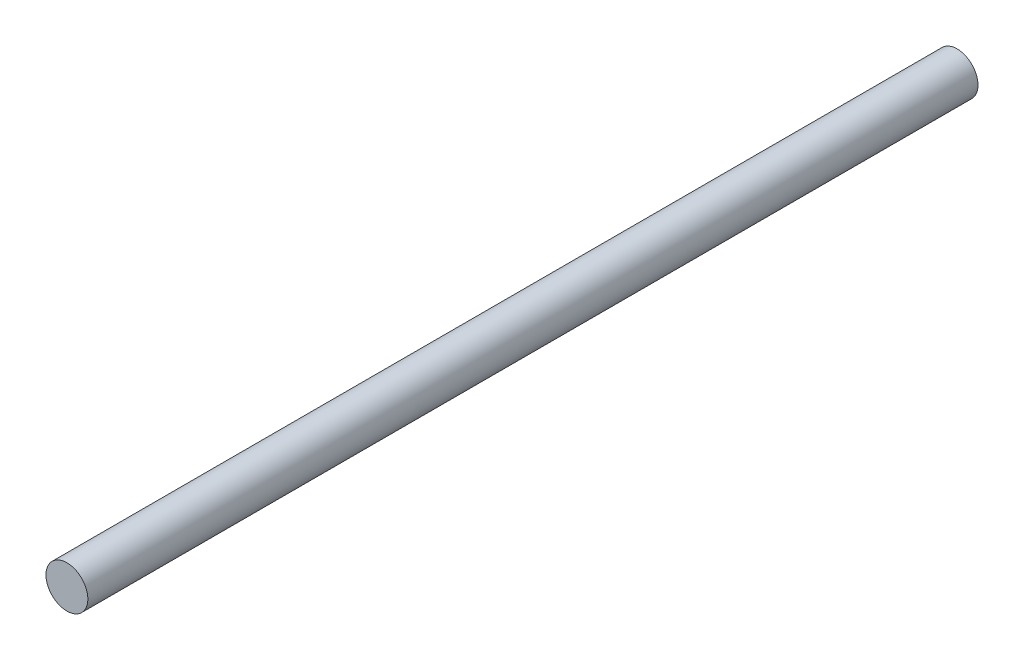
ISO-10303-21;
HEADER;
FILE_DESCRIPTION(('STEP AP214'),'2;1');
FILE_NAME('part.step','',(''),(''),'','','');
FILE_SCHEMA(('AUTOMOTIVE_DESIGN { 1 0 10303 214 1 1 1 1 }'));
ENDSEC;
DATA;
#1=APPLICATION_CONTEXT('core data for automotive mechanical design processes');
#2=APPLICATION_PROTOCOL_DEFINITION('international standard','automotive_design',2000,#1);
#3=PRODUCT_CONTEXT('',#1,'mechanical');
#4=PRODUCT('Part','Part','',(#3));
#5=PRODUCT_RELATED_PRODUCT_CATEGORY('part','',(#4));
#6=PRODUCT_DEFINITION_FORMATION('','',#4);
#7=PRODUCT_DEFINITION_CONTEXT('part definition',#1,'design');
#8=PRODUCT_DEFINITION('design','',#6,#7);
#9=PRODUCT_DEFINITION_SHAPE('','',#8);
#10=(LENGTH_UNIT() NAMED_UNIT(*) SI_UNIT(.MILLI.,.METRE.));
#11=(NAMED_UNIT(*) PLANE_ANGLE_UNIT() SI_UNIT($,.RADIAN.));
#12=(NAMED_UNIT(*) SI_UNIT($,.STERADIAN.) SOLID_ANGLE_UNIT());
#13=UNCERTAINTY_MEASURE_WITH_UNIT(LENGTH_MEASURE(1.E-05),#10,'distance_accuracy_value','');
#14=(GEOMETRIC_REPRESENTATION_CONTEXT(3) GLOBAL_UNCERTAINTY_ASSIGNED_CONTEXT((#13)) GLOBAL_UNIT_ASSIGNED_CONTEXT((#10,
#11,#12)) REPRESENTATION_CONTEXT('',''));
#15=CARTESIAN_POINT('',(0.,0.,0.));
#16=DIRECTION('',(0.,0.,1.));
#17=DIRECTION('',(1.,0.,0.));
#18=AXIS2_PLACEMENT_3D('',#15,#16,#17);
#19=CARTESIAN_POINT('',(0.,0.,85.));
#20=DIRECTION('',(0.,0.,-1.));
#21=DIRECTION('',(-1.,0.,0.));
#22=AXIS2_PLACEMENT_3D('',#19,#20,#21);
#23=CYLINDRICAL_SURFACE('',#22,2.);
#24=CARTESIAN_POINT('',(0.,0.,85.));
#25=DIRECTION('',(0.,0.,1.));
#26=DIRECTION('',(1.,0.,0.));
#27=AXIS2_PLACEMENT_3D('',#24,#25,#26);
#28=CIRCLE('',#27,2.);
#29=CARTESIAN_POINT('',(2.,0.,85.));
#30=VERTEX_POINT('',#29);
#31=EDGE_CURVE('E10',#30,#30,#28,.T.);
#32=ORIENTED_EDGE('',*,*,#31,.F.);
#33=EDGE_LOOP('',(#32));
#34=FACE_BOUND('',#33,.T.);
#35=CARTESIAN_POINT('',(0.,0.,0.));
#36=DIRECTION('',(0.,0.,1.));
#37=DIRECTION('',(1.,0.,0.));
#38=AXIS2_PLACEMENT_3D('',#35,#36,#37);
#39=CIRCLE('',#38,2.);
#40=CARTESIAN_POINT('',(2.,0.,0.));
#41=VERTEX_POINT('',#40);
#42=EDGE_CURVE('E36',#41,#41,#39,.T.);
#43=ORIENTED_EDGE('',*,*,#42,.T.);
#44=EDGE_LOOP('',(#43));
#45=FACE_BOUND('',#44,.T.);
#46=ADVANCED_FACE('F33',(#34,#45),#23,.T.);
#47=CARTESIAN_POINT('',(0.,0.,85.));
#48=DIRECTION('',(0.,0.,1.));
#49=DIRECTION('',(1.,0.,0.));
#50=AXIS2_PLACEMENT_3D('',#47,#48,#49);
#51=PLANE('',#50);
#52=ORIENTED_EDGE('',*,*,#31,.T.);
#53=EDGE_LOOP('',(#52));
#54=FACE_BOUND('',#53,.T.);
#55=ADVANCED_FACE('F48',(#54),#51,.T.);
#56=CARTESIAN_POINT('',(0.,0.,0.));
#57=DIRECTION('',(0.,0.,1.));
#58=DIRECTION('',(1.,0.,0.));
#59=AXIS2_PLACEMENT_3D('',#56,#57,#58);
#60=PLANE('',#59);
#61=ORIENTED_EDGE('',*,*,#42,.F.);
#62=EDGE_LOOP('',(#61));
#63=FACE_BOUND('',#62,.T.);
#64=ADVANCED_FACE('F46',(#63),#60,.F.);
#65=CLOSED_SHELL('',(#46,#55,#64));
#66=MANIFOLD_SOLID_BREP('B2',#65);
#67=ADVANCED_BREP_SHAPE_REPRESENTATION('',(#18,#66),#14);
#68=SHAPE_DEFINITION_REPRESENTATION(#9,#67);
ENDSEC;
END-ISO-10303-21;
